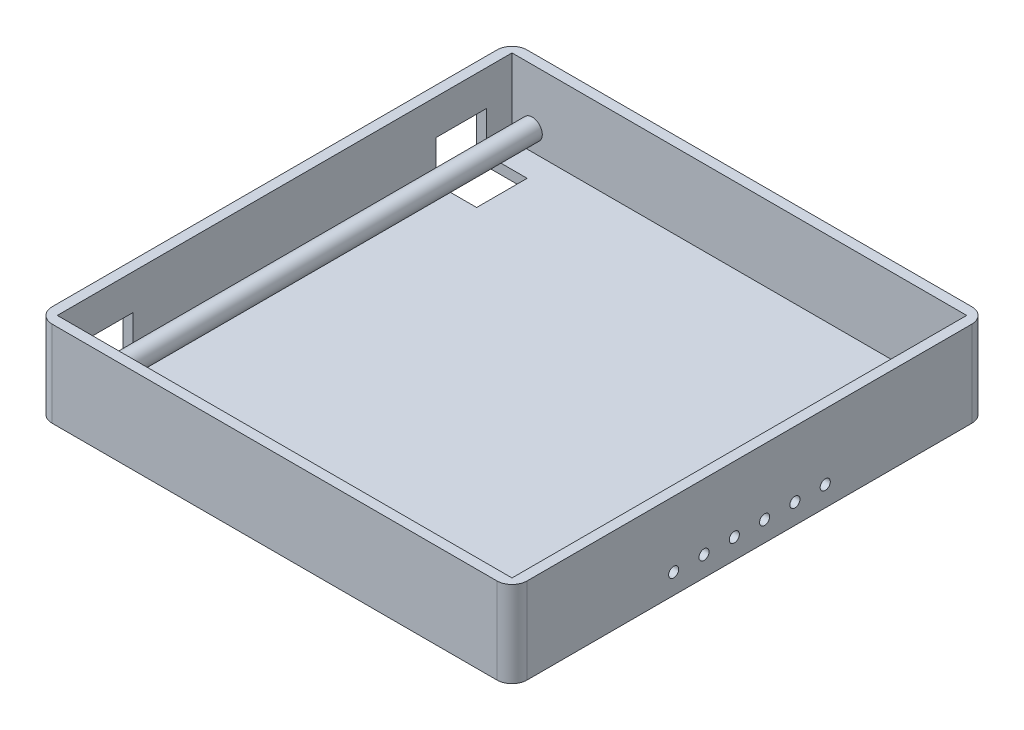
ISO-10303-21;
HEADER;
FILE_DESCRIPTION(('STEP AP214'),'2;1');
FILE_NAME('part.step','',(''),(''),'','','');
FILE_SCHEMA(('AUTOMOTIVE_DESIGN { 1 0 10303 214 1 1 1 1 }'));
ENDSEC;
DATA;
#1=APPLICATION_CONTEXT('core data for automotive mechanical design processes');
#2=APPLICATION_PROTOCOL_DEFINITION('international standard','automotive_design',2000,#1);
#3=PRODUCT_CONTEXT('',#1,'mechanical');
#4=PRODUCT('Part','Part','',(#3));
#5=PRODUCT_RELATED_PRODUCT_CATEGORY('part','',(#4));
#6=PRODUCT_DEFINITION_FORMATION('','',#4);
#7=PRODUCT_DEFINITION_CONTEXT('part definition',#1,'design');
#8=PRODUCT_DEFINITION('design','',#6,#7);
#9=PRODUCT_DEFINITION_SHAPE('','',#8);
#10=(LENGTH_UNIT() NAMED_UNIT(*) SI_UNIT(.MILLI.,.METRE.));
#11=(NAMED_UNIT(*) PLANE_ANGLE_UNIT() SI_UNIT($,.RADIAN.));
#12=(NAMED_UNIT(*) SI_UNIT($,.STERADIAN.) SOLID_ANGLE_UNIT());
#13=UNCERTAINTY_MEASURE_WITH_UNIT(LENGTH_MEASURE(1.E-05),#10,'distance_accuracy_value','');
#14=(GEOMETRIC_REPRESENTATION_CONTEXT(3) GLOBAL_UNCERTAINTY_ASSIGNED_CONTEXT((#13)) GLOBAL_UNIT_ASSIGNED_CONTEXT((#10,
#11,#12)) REPRESENTATION_CONTEXT('',''));
#15=CARTESIAN_POINT('',(0.,0.,0.));
#16=DIRECTION('',(0.,0.,1.));
#17=DIRECTION('',(1.,0.,0.));
#18=AXIS2_PLACEMENT_3D('',#15,#16,#17);
#19=CARTESIAN_POINT('',(46.,2.,-31.));
#20=DIRECTION('',(1.,0.,0.));
#21=DIRECTION('',(0.,0.,-1.));
#22=AXIS2_PLACEMENT_3D('',#19,#20,#21);
#23=CYLINDRICAL_SURFACE('',#22,0.499999999999999);
#24=CARTESIAN_POINT('',(46.,2.,-31.));
#25=DIRECTION('',(1.,0.,0.));
#26=DIRECTION('',(0.,0.,-1.));
#27=AXIS2_PLACEMENT_3D('',#24,#25,#26);
#28=CIRCLE('',#27,0.499999999999999);
#29=CARTESIAN_POINT('',(46.,2.,-31.5));
#30=VERTEX_POINT('',#29);
#31=EDGE_CURVE('E400',#30,#30,#28,.T.);
#32=ORIENTED_EDGE('',*,*,#31,.F.);
#33=EDGE_LOOP('',(#32));
#34=FACE_BOUND('',#33,.T.);
#35=CARTESIAN_POINT('',(47.,2.,-31.));
#36=DIRECTION('',(1.,0.,0.));
#37=DIRECTION('',(0.,0.,-1.));
#38=AXIS2_PLACEMENT_3D('',#35,#36,#37);
#39=CIRCLE('',#38,0.499999999999999);
#40=CARTESIAN_POINT('',(47.,2.,-31.5));
#41=VERTEX_POINT('',#40);
#42=EDGE_CURVE('E404',#41,#41,#39,.T.);
#43=ORIENTED_EDGE('',*,*,#42,.T.);
#44=EDGE_LOOP('',(#43));
#45=FACE_BOUND('',#44,.T.);
#46=ADVANCED_FACE('F39',(#34,#45),#23,.F.);
#47=CARTESIAN_POINT('',(46.,2.,-28.));
#48=DIRECTION('',(1.,0.,0.));
#49=DIRECTION('',(0.,0.,-1.));
#50=AXIS2_PLACEMENT_3D('',#47,#48,#49);
#51=CYLINDRICAL_SURFACE('',#50,0.499999999999999);
#52=CARTESIAN_POINT('',(46.,2.,-28.));
#53=DIRECTION('',(1.,0.,0.));
#54=DIRECTION('',(0.,0.,-1.));
#55=AXIS2_PLACEMENT_3D('',#52,#53,#54);
#56=CIRCLE('',#55,0.499999999999999);
#57=CARTESIAN_POINT('',(46.,2.,-28.5));
#58=VERTEX_POINT('',#57);
#59=EDGE_CURVE('E392',#58,#58,#56,.T.);
#60=ORIENTED_EDGE('',*,*,#59,.F.);
#61=EDGE_LOOP('',(#60));
#62=FACE_BOUND('',#61,.T.);
#63=CARTESIAN_POINT('',(47.,2.,-28.));
#64=DIRECTION('',(1.,0.,0.));
#65=DIRECTION('',(0.,0.,-1.));
#66=AXIS2_PLACEMENT_3D('',#63,#64,#65);
#67=CIRCLE('',#66,0.499999999999999);
#68=CARTESIAN_POINT('',(47.,2.,-28.5));
#69=VERTEX_POINT('',#68);
#70=EDGE_CURVE('E396',#69,#69,#67,.T.);
#71=ORIENTED_EDGE('',*,*,#70,.T.);
#72=EDGE_LOOP('',(#71));
#73=FACE_BOUND('',#72,.T.);
#74=ADVANCED_FACE('F581',(#62,#73),#51,.F.);
#75=CARTESIAN_POINT('',(46.,2.,-25.));
#76=DIRECTION('',(1.,0.,0.));
#77=DIRECTION('',(0.,0.,-1.));
#78=AXIS2_PLACEMENT_3D('',#75,#76,#77);
#79=CYLINDRICAL_SURFACE('',#78,0.499999999999999);
#80=CARTESIAN_POINT('',(46.,2.,-25.));
#81=DIRECTION('',(1.,0.,0.));
#82=DIRECTION('',(0.,0.,-1.));
#83=AXIS2_PLACEMENT_3D('',#80,#81,#82);
#84=CIRCLE('',#83,0.499999999999999);
#85=CARTESIAN_POINT('',(46.,2.,-25.5));
#86=VERTEX_POINT('',#85);
#87=EDGE_CURVE('E384',#86,#86,#84,.T.);
#88=ORIENTED_EDGE('',*,*,#87,.F.);
#89=EDGE_LOOP('',(#88));
#90=FACE_BOUND('',#89,.T.);
#91=CARTESIAN_POINT('',(47.,2.,-25.));
#92=DIRECTION('',(1.,0.,0.));
#93=DIRECTION('',(0.,0.,-1.));
#94=AXIS2_PLACEMENT_3D('',#91,#92,#93);
#95=CIRCLE('',#94,0.499999999999999);
#96=CARTESIAN_POINT('',(47.,2.,-25.5));
#97=VERTEX_POINT('',#96);
#98=EDGE_CURVE('E388',#97,#97,#95,.T.);
#99=ORIENTED_EDGE('',*,*,#98,.T.);
#100=EDGE_LOOP('',(#99));
#101=FACE_BOUND('',#100,.T.);
#102=ADVANCED_FACE('F587',(#90,#101),#79,.F.);
#103=CARTESIAN_POINT('',(46.,2.,-22.));
#104=DIRECTION('',(1.,0.,0.));
#105=DIRECTION('',(0.,0.,-1.));
#106=AXIS2_PLACEMENT_3D('',#103,#104,#105);
#107=CYLINDRICAL_SURFACE('',#106,0.499999999999999);
#108=CARTESIAN_POINT('',(46.,2.,-22.));
#109=DIRECTION('',(1.,0.,0.));
#110=DIRECTION('',(0.,0.,-1.));
#111=AXIS2_PLACEMENT_3D('',#108,#109,#110);
#112=CIRCLE('',#111,0.499999999999999);
#113=CARTESIAN_POINT('',(46.,2.,-22.5));
#114=VERTEX_POINT('',#113);
#115=EDGE_CURVE('E376',#114,#114,#112,.T.);
#116=ORIENTED_EDGE('',*,*,#115,.F.);
#117=EDGE_LOOP('',(#116));
#118=FACE_BOUND('',#117,.T.);
#119=CARTESIAN_POINT('',(47.,2.,-22.));
#120=DIRECTION('',(1.,0.,0.));
#121=DIRECTION('',(0.,0.,-1.));
#122=AXIS2_PLACEMENT_3D('',#119,#120,#121);
#123=CIRCLE('',#122,0.499999999999999);
#124=CARTESIAN_POINT('',(47.,2.,-22.5));
#125=VERTEX_POINT('',#124);
#126=EDGE_CURVE('E380',#125,#125,#123,.T.);
#127=ORIENTED_EDGE('',*,*,#126,.T.);
#128=EDGE_LOOP('',(#127));
#129=FACE_BOUND('',#128,.T.);
#130=ADVANCED_FACE('F641',(#118,#129),#107,.F.);
#131=CARTESIAN_POINT('',(0.,1.,0.));
#132=DIRECTION('',(1.,0.,0.));
#133=DIRECTION('',(0.,0.,-1.));
#134=AXIS2_PLACEMENT_3D('',#131,#132,#133);
#135=PLANE('',#134);
#136=DIRECTION('',(0.,0.,1.));
#137=VECTOR('',#136,1.);
#138=CARTESIAN_POINT('',(0.,0.,0.));
#139=LINE('',#138,#137);
#140=CARTESIAN_POINT('',(0.,0.,-45.5));
#141=VERTEX_POINT('',#140);
#142=CARTESIAN_POINT('',(0.,0.,-43.5));
#143=VERTEX_POINT('',#142);
#144=EDGE_CURVE('E360',#141,#143,#139,.T.);
#145=ORIENTED_EDGE('',*,*,#144,.T.);
#146=DIRECTION('',(0.,-1.,0.));
#147=VECTOR('',#146,1.);
#148=CARTESIAN_POINT('',(0.,0.,-43.5));
#149=LINE('',#148,#147);
#150=CARTESIAN_POINT('',(0.,5.,-43.5));
#151=VERTEX_POINT('',#150);
#152=EDGE_CURVE('E221',#151,#143,#149,.T.);
#153=ORIENTED_EDGE('',*,*,#152,.F.);
#154=DIRECTION('',(0.,0.,-1.));
#155=VECTOR('',#154,1.);
#156=CARTESIAN_POINT('',(0.,5.,-43.5));
#157=LINE('',#156,#155);
#158=CARTESIAN_POINT('',(0.,5.,-38.5));
#159=VERTEX_POINT('',#158);
#160=EDGE_CURVE('E522',#159,#151,#157,.T.);
#161=ORIENTED_EDGE('',*,*,#160,.F.);
#162=DIRECTION('',(0.,1.,0.));
#163=VECTOR('',#162,1.);
#164=CARTESIAN_POINT('',(0.,5.,-38.5));
#165=LINE('',#164,#163);
#166=CARTESIAN_POINT('',(0.,0.,-38.5));
#167=VERTEX_POINT('',#166);
#168=EDGE_CURVE('E261',#167,#159,#165,.T.);
#169=ORIENTED_EDGE('',*,*,#168,.F.);
#170=CARTESIAN_POINT('',(0.,0.,-8.5));
#171=VERTEX_POINT('',#170);
#172=EDGE_CURVE('E226',#167,#171,#139,.T.);
#173=ORIENTED_EDGE('',*,*,#172,.T.);
#174=DIRECTION('',(0.,-1.,0.));
#175=VECTOR('',#174,1.);
#176=CARTESIAN_POINT('',(0.,0.,-8.5));
#177=LINE('',#176,#175);
#178=CARTESIAN_POINT('',(0.,5.,-8.5));
#179=VERTEX_POINT('',#178);
#180=EDGE_CURVE('E242',#179,#171,#177,.T.);
#181=ORIENTED_EDGE('',*,*,#180,.F.);
#182=DIRECTION('',(0.,0.,-1.));
#183=VECTOR('',#182,1.);
#184=CARTESIAN_POINT('',(0.,5.,-8.5));
#185=LINE('',#184,#183);
#186=CARTESIAN_POINT('',(0.,5.,-3.5));
#187=VERTEX_POINT('',#186);
#188=EDGE_CURVE('E253',#187,#179,#185,.T.);
#189=ORIENTED_EDGE('',*,*,#188,.F.);
#190=DIRECTION('',(0.,1.,0.));
#191=VECTOR('',#190,1.);
#192=CARTESIAN_POINT('',(0.,5.,-3.5));
#193=LINE('',#192,#191);
#194=CARTESIAN_POINT('',(0.,0.,-3.5));
#195=VERTEX_POINT('',#194);
#196=EDGE_CURVE('E249',#195,#187,#193,.T.);
#197=ORIENTED_EDGE('',*,*,#196,.F.);
#198=CARTESIAN_POINT('',(0.,0.,-1.5));
#199=VERTEX_POINT('',#198);
#200=EDGE_CURVE('E359',#195,#199,#139,.T.);
#201=ORIENTED_EDGE('',*,*,#200,.T.);
#202=DIRECTION('',(0.,-1.,0.));
#203=VECTOR('',#202,1.);
#204=CARTESIAN_POINT('',(0.,1.,-1.5));
#205=LINE('',#204,#203);
#206=CARTESIAN_POINT('',(0.,8.5,-1.5));
#207=VERTEX_POINT('',#206);
#208=EDGE_CURVE('E451',#199,#207,#205,.F.);
#209=ORIENTED_EDGE('',*,*,#208,.T.);
#210=DIRECTION('',(0.,0.,1.));
#211=VECTOR('',#210,1.);
#212=CARTESIAN_POINT('',(0.,8.5,-47.));
#213=LINE('',#212,#211);
#214=CARTESIAN_POINT('',(0.,8.5,-45.5));
#215=VERTEX_POINT('',#214);
#216=EDGE_CURVE('E351',#215,#207,#213,.T.);
#217=ORIENTED_EDGE('',*,*,#216,.F.);
#218=DIRECTION('',(0.,-1.,0.));
#219=VECTOR('',#218,1.);
#220=CARTESIAN_POINT('',(0.,1.,-45.5));
#221=LINE('',#220,#219);
#222=EDGE_CURVE('E447',#215,#141,#221,.T.);
#223=ORIENTED_EDGE('',*,*,#222,.T.);
#224=EDGE_LOOP('',(#145,#153,#161,#169,#173,#181,#189,#197,#201,#209,#217,#223));
#225=FACE_BOUND('',#224,.T.);
#226=ADVANCED_FACE('F515',(#225),#135,.F.);
#227=CARTESIAN_POINT('',(0.,1.,0.));
#228=DIRECTION('',(0.,0.,-1.));
#229=DIRECTION('',(-1.,0.,0.));
#230=AXIS2_PLACEMENT_3D('',#227,#228,#229);
#231=PLANE('',#230);
#232=DIRECTION('',(1.,0.,0.));
#233=VECTOR('',#232,1.);
#234=CARTESIAN_POINT('',(0.,0.,0.));
#235=LINE('',#234,#233);
#236=CARTESIAN_POINT('',(1.5,0.,0.));
#237=VERTEX_POINT('',#236);
#238=CARTESIAN_POINT('',(45.5,0.,0.));
#239=VERTEX_POINT('',#238);
#240=EDGE_CURVE('E364',#237,#239,#235,.T.);
#241=ORIENTED_EDGE('',*,*,#240,.T.);
#242=DIRECTION('',(0.,-1.,0.));
#243=VECTOR('',#242,1.);
#244=CARTESIAN_POINT('',(45.5,1.,0.));
#245=LINE('',#244,#243);
#246=CARTESIAN_POINT('',(45.5,8.5,0.));
#247=VERTEX_POINT('',#246);
#248=EDGE_CURVE('E432',#239,#247,#245,.F.);
#249=ORIENTED_EDGE('',*,*,#248,.T.);
#250=DIRECTION('',(1.,0.,0.));
#251=VECTOR('',#250,1.);
#252=CARTESIAN_POINT('',(0.,8.5,0.));
#253=LINE('',#252,#251);
#254=CARTESIAN_POINT('',(1.5,8.5,0.));
#255=VERTEX_POINT('',#254);
#256=EDGE_CURVE('E355',#255,#247,#253,.T.);
#257=ORIENTED_EDGE('',*,*,#256,.F.);
#258=DIRECTION('',(0.,-1.,0.));
#259=VECTOR('',#258,1.);
#260=CARTESIAN_POINT('',(1.5,1.,0.));
#261=LINE('',#260,#259);
#262=EDGE_CURVE('E428',#255,#237,#261,.T.);
#263=ORIENTED_EDGE('',*,*,#262,.T.);
#264=EDGE_LOOP('',(#241,#249,#257,#263));
#265=FACE_BOUND('',#264,.T.);
#266=ADVANCED_FACE('F559',(#265),#231,.F.);
#267=CARTESIAN_POINT('',(47.,1.,0.));
#268=DIRECTION('',(-1.,0.,0.));
#269=DIRECTION('',(0.,0.,1.));
#270=AXIS2_PLACEMENT_3D('',#267,#268,#269);
#271=PLANE('',#270);
#272=CARTESIAN_POINT('',(47.,2.,-19.));
#273=DIRECTION('',(1.,0.,0.));
#274=DIRECTION('',(0.,0.,-1.));
#275=AXIS2_PLACEMENT_3D('',#272,#273,#274);
#276=CIRCLE('',#275,0.499999999999999);
#277=CARTESIAN_POINT('',(47.,2.,-19.5));
#278=VERTEX_POINT('',#277);
#279=EDGE_CURVE('E286',#278,#278,#276,.T.);
#280=ORIENTED_EDGE('',*,*,#279,.F.);
#281=EDGE_LOOP('',(#280));
#282=FACE_BOUND('',#281,.T.);
#283=CARTESIAN_POINT('',(47.,2.,-16.));
#284=DIRECTION('',(1.,0.,0.));
#285=DIRECTION('',(0.,0.,-1.));
#286=AXIS2_PLACEMENT_3D('',#283,#284,#285);
#287=CIRCLE('',#286,0.499999999999999);
#288=CARTESIAN_POINT('',(47.,2.,-16.5));
#289=VERTEX_POINT('',#288);
#290=EDGE_CURVE('E290',#289,#289,#287,.T.);
#291=ORIENTED_EDGE('',*,*,#290,.F.);
#292=EDGE_LOOP('',(#291));
#293=FACE_BOUND('',#292,.T.);
#294=DIRECTION('',(0.,0.,-1.));
#295=VECTOR('',#294,1.);
#296=CARTESIAN_POINT('',(47.,8.5,0.));
#297=LINE('',#296,#295);
#298=CARTESIAN_POINT('',(47.,8.5,-1.5));
#299=VERTEX_POINT('',#298);
#300=CARTESIAN_POINT('',(47.,8.5,-45.5));
#301=VERTEX_POINT('',#300);
#302=EDGE_CURVE('E343',#299,#301,#297,.T.);
#303=ORIENTED_EDGE('',*,*,#302,.F.);
#304=DIRECTION('',(0.,-1.,0.));
#305=VECTOR('',#304,1.);
#306=CARTESIAN_POINT('',(47.,1.,-1.5));
#307=LINE('',#306,#305);
#308=CARTESIAN_POINT('',(47.,0.,-1.5));
#309=VERTEX_POINT('',#308);
#310=EDGE_CURVE('E411',#299,#309,#307,.T.);
#311=ORIENTED_EDGE('',*,*,#310,.T.);
#312=DIRECTION('',(0.,0.,-1.));
#313=VECTOR('',#312,1.);
#314=CARTESIAN_POINT('',(47.,0.,0.));
#315=LINE('',#314,#313);
#316=CARTESIAN_POINT('',(47.,0.,-45.5));
#317=VERTEX_POINT('',#316);
#318=EDGE_CURVE('E368',#309,#317,#315,.T.);
#319=ORIENTED_EDGE('',*,*,#318,.T.);
#320=DIRECTION('',(0.,-1.,0.));
#321=VECTOR('',#320,1.);
#322=CARTESIAN_POINT('',(47.,1.,-45.5));
#323=LINE('',#322,#321);
#324=EDGE_CURVE('E408',#317,#301,#323,.F.);
#325=ORIENTED_EDGE('',*,*,#324,.T.);
#326=EDGE_LOOP('',(#303,#311,#319,#325));
#327=FACE_BOUND('',#326,.T.);
#328=ORIENTED_EDGE('',*,*,#126,.F.);
#329=EDGE_LOOP('',(#328));
#330=FACE_BOUND('',#329,.T.);
#331=ORIENTED_EDGE('',*,*,#98,.F.);
#332=EDGE_LOOP('',(#331));
#333=FACE_BOUND('',#332,.T.);
#334=ORIENTED_EDGE('',*,*,#70,.F.);
#335=EDGE_LOOP('',(#334));
#336=FACE_BOUND('',#335,.T.);
#337=ORIENTED_EDGE('',*,*,#42,.F.);
#338=EDGE_LOOP('',(#337));
#339=FACE_BOUND('',#338,.T.);
#340=ADVANCED_FACE('F568',(#282,#293,#327,#330,#333,#336,#339),#271,.F.);
#341=CARTESIAN_POINT('',(0.,1.,-47.));
#342=DIRECTION('',(0.,0.,1.));
#343=DIRECTION('',(1.,0.,0.));
#344=AXIS2_PLACEMENT_3D('',#341,#342,#343);
#345=PLANE('',#344);
#346=DIRECTION('',(-1.,0.,0.));
#347=VECTOR('',#346,1.);
#348=CARTESIAN_POINT('',(47.,8.5,-47.));
#349=LINE('',#348,#347);
#350=CARTESIAN_POINT('',(45.5,8.5,-47.));
#351=VERTEX_POINT('',#350);
#352=CARTESIAN_POINT('',(1.49999999999999,8.5,-47.));
#353=VERTEX_POINT('',#352);
#354=EDGE_CURVE('E347',#351,#353,#349,.T.);
#355=ORIENTED_EDGE('',*,*,#354,.F.);
#356=DIRECTION('',(0.,-1.,0.));
#357=VECTOR('',#356,1.);
#358=CARTESIAN_POINT('',(45.5,1.,-47.));
#359=LINE('',#358,#357);
#360=CARTESIAN_POINT('',(45.5,0.,-47.));
#361=VERTEX_POINT('',#360);
#362=EDGE_CURVE('E457',#351,#361,#359,.T.);
#363=ORIENTED_EDGE('',*,*,#362,.T.);
#364=DIRECTION('',(-1.,0.,0.));
#365=VECTOR('',#364,1.);
#366=CARTESIAN_POINT('',(0.,0.,-47.));
#367=LINE('',#366,#365);
#368=CARTESIAN_POINT('',(1.49999999999999,0.,-47.));
#369=VERTEX_POINT('',#368);
#370=EDGE_CURVE('E372',#361,#369,#367,.T.);
#371=ORIENTED_EDGE('',*,*,#370,.T.);
#372=DIRECTION('',(0.,-1.,0.));
#373=VECTOR('',#372,1.);
#374=CARTESIAN_POINT('',(1.49999999999999,1.,-47.));
#375=LINE('',#374,#373);
#376=EDGE_CURVE('E454',#369,#353,#375,.F.);
#377=ORIENTED_EDGE('',*,*,#376,.T.);
#378=EDGE_LOOP('',(#355,#363,#371,#377));
#379=FACE_BOUND('',#378,.T.);
#380=ADVANCED_FACE('F545',(#379),#345,.F.);
#381=CARTESIAN_POINT('',(0.,0.,0.));
#382=DIRECTION('',(0.,-1.,0.));
#383=DIRECTION('',(0.,0.,-1.));
#384=AXIS2_PLACEMENT_3D('',#381,#382,#383);
#385=PLANE('',#384);
#386=DIRECTION('',(-1.,0.,0.));
#387=VECTOR('',#386,1.);
#388=CARTESIAN_POINT('',(4.99999999999999,0.,-43.5));
#389=LINE('',#388,#387);
#390=CARTESIAN_POINT('',(4.99999999999999,0.,-43.5));
#391=VERTEX_POINT('',#390);
#392=EDGE_CURVE('E56',#391,#143,#389,.T.);
#393=ORIENTED_EDGE('',*,*,#392,.T.);
#394=ORIENTED_EDGE('',*,*,#144,.F.);
#395=CARTESIAN_POINT('',(1.49999999999999,0.,-45.5));
#396=DIRECTION('',(0.,-1.,0.));
#397=DIRECTION('',(0.,0.,-1.));
#398=AXIS2_PLACEMENT_3D('',#395,#396,#397);
#399=CIRCLE('',#398,1.5);
#400=EDGE_CURVE('E415',#141,#369,#399,.T.);
#401=ORIENTED_EDGE('',*,*,#400,.T.);
#402=ORIENTED_EDGE('',*,*,#370,.F.);
#403=CARTESIAN_POINT('',(45.5,0.,-45.5));
#404=DIRECTION('',(0.,-1.,0.));
#405=DIRECTION('',(0.,0.,-1.));
#406=AXIS2_PLACEMENT_3D('',#403,#404,#405);
#407=CIRCLE('',#406,1.5);
#408=EDGE_CURVE('E418',#361,#317,#407,.T.);
#409=ORIENTED_EDGE('',*,*,#408,.T.);
#410=ORIENTED_EDGE('',*,*,#318,.F.);
#411=CARTESIAN_POINT('',(45.5,0.,-1.5));
#412=DIRECTION('',(0.,-1.,0.));
#413=DIRECTION('',(0.,0.,-1.));
#414=AXIS2_PLACEMENT_3D('',#411,#412,#413);
#415=CIRCLE('',#414,1.5);
#416=EDGE_CURVE('E425',#309,#239,#415,.T.);
#417=ORIENTED_EDGE('',*,*,#416,.T.);
#418=ORIENTED_EDGE('',*,*,#240,.F.);
#419=CARTESIAN_POINT('',(1.5,0.,-1.5));
#420=DIRECTION('',(0.,-1.,0.));
#421=DIRECTION('',(0.,0.,-1.));
#422=AXIS2_PLACEMENT_3D('',#419,#420,#421);
#423=CIRCLE('',#422,1.5);
#424=EDGE_CURVE('E421',#237,#199,#423,.T.);
#425=ORIENTED_EDGE('',*,*,#424,.T.);
#426=ORIENTED_EDGE('',*,*,#200,.F.);
#427=DIRECTION('',(-1.,0.,0.));
#428=VECTOR('',#427,1.);
#429=CARTESIAN_POINT('',(5.,0.,-3.5));
#430=LINE('',#429,#428);
#431=CARTESIAN_POINT('',(5.,0.,-3.5));
#432=VERTEX_POINT('',#431);
#433=EDGE_CURVE('E248',#432,#195,#430,.T.);
#434=ORIENTED_EDGE('',*,*,#433,.F.);
#435=DIRECTION('',(0.,0.,1.));
#436=VECTOR('',#435,1.);
#437=CARTESIAN_POINT('',(5.,0.,-3.5));
#438=LINE('',#437,#436);
#439=CARTESIAN_POINT('',(5.,0.,-8.5));
#440=VERTEX_POINT('',#439);
#441=EDGE_CURVE('E237',#440,#432,#438,.T.);
#442=ORIENTED_EDGE('',*,*,#441,.F.);
#443=DIRECTION('',(-1.,0.,0.));
#444=VECTOR('',#443,1.);
#445=CARTESIAN_POINT('',(5.,0.,-8.5));
#446=LINE('',#445,#444);
#447=EDGE_CURVE('E64',#440,#171,#446,.T.);
#448=ORIENTED_EDGE('',*,*,#447,.T.);
#449=ORIENTED_EDGE('',*,*,#172,.F.);
#450=DIRECTION('',(-1.,0.,0.));
#451=VECTOR('',#450,1.);
#452=CARTESIAN_POINT('',(4.99999999999999,0.,-38.5));
#453=LINE('',#452,#451);
#454=CARTESIAN_POINT('',(4.99999999999999,0.,-38.5));
#455=VERTEX_POINT('',#454);
#456=EDGE_CURVE('E207',#455,#167,#453,.T.);
#457=ORIENTED_EDGE('',*,*,#456,.F.);
#458=DIRECTION('',(0.,0.,1.));
#459=VECTOR('',#458,1.);
#460=CARTESIAN_POINT('',(4.99999999999999,0.,-38.5));
#461=LINE('',#460,#459);
#462=EDGE_CURVE('E215',#391,#455,#461,.T.);
#463=ORIENTED_EDGE('',*,*,#462,.F.);
#464=EDGE_LOOP('',(#393,#394,#401,#402,#409,#410,#417,#418,#425,#426,#434,#442,#448,#449,#457,#463));
#465=FACE_BOUND('',#464,.T.);
#466=ADVANCED_FACE('F224',(#465),#385,.T.);
#467=CARTESIAN_POINT('',(0.,8.5,0.));
#468=DIRECTION('',(0.,1.,0.));
#469=DIRECTION('',(0.,0.,1.));
#470=AXIS2_PLACEMENT_3D('',#467,#468,#469);
#471=PLANE('',#470);
#472=ORIENTED_EDGE('',*,*,#256,.T.);
#473=CARTESIAN_POINT('',(45.5,8.5,-1.5));
#474=DIRECTION('',(0.,1.,0.));
#475=DIRECTION('',(0.,0.,1.));
#476=AXIS2_PLACEMENT_3D('',#473,#474,#475);
#477=CIRCLE('',#476,1.5);
#478=EDGE_CURVE('E444',#247,#299,#477,.T.);
#479=ORIENTED_EDGE('',*,*,#478,.T.);
#480=ORIENTED_EDGE('',*,*,#302,.T.);
#481=CARTESIAN_POINT('',(45.5,8.5,-45.5));
#482=DIRECTION('',(0.,1.,0.));
#483=DIRECTION('',(0.,0.,1.));
#484=AXIS2_PLACEMENT_3D('',#481,#482,#483);
#485=CIRCLE('',#484,1.5);
#486=EDGE_CURVE('E438',#301,#351,#485,.T.);
#487=ORIENTED_EDGE('',*,*,#486,.T.);
#488=ORIENTED_EDGE('',*,*,#354,.T.);
#489=CARTESIAN_POINT('',(1.49999999999999,8.5,-45.5));
#490=DIRECTION('',(0.,1.,0.));
#491=DIRECTION('',(0.,0.,1.));
#492=AXIS2_PLACEMENT_3D('',#489,#490,#491);
#493=CIRCLE('',#492,1.5);
#494=EDGE_CURVE('E435',#353,#215,#493,.T.);
#495=ORIENTED_EDGE('',*,*,#494,.T.);
#496=ORIENTED_EDGE('',*,*,#216,.T.);
#497=CARTESIAN_POINT('',(1.5,8.5,-1.5));
#498=DIRECTION('',(0.,1.,0.));
#499=DIRECTION('',(0.,0.,1.));
#500=AXIS2_PLACEMENT_3D('',#497,#498,#499);
#501=CIRCLE('',#500,1.5);
#502=EDGE_CURVE('E441',#207,#255,#501,.T.);
#503=ORIENTED_EDGE('',*,*,#502,.T.);
#504=EDGE_LOOP('',(#472,#479,#480,#487,#488,#495,#496,#503));
#505=FACE_BOUND('',#504,.T.);
#506=DIRECTION('',(-1.,0.,0.));
#507=VECTOR('',#506,1.);
#508=CARTESIAN_POINT('',(46.,8.5,-46.));
#509=LINE('',#508,#507);
#510=CARTESIAN_POINT('',(46.,8.5,-46.));
#511=VERTEX_POINT('',#510);
#512=CARTESIAN_POINT('',(0.999999999999986,8.5,-46.));
#513=VERTEX_POINT('',#512);
#514=EDGE_CURVE('E302',#511,#513,#509,.T.);
#515=ORIENTED_EDGE('',*,*,#514,.F.);
#516=DIRECTION('',(0.,0.,-1.));
#517=VECTOR('',#516,1.);
#518=CARTESIAN_POINT('',(46.,8.5,-1.));
#519=LINE('',#518,#517);
#520=CARTESIAN_POINT('',(46.,8.5,-1.));
#521=VERTEX_POINT('',#520);
#522=EDGE_CURVE('E299',#521,#511,#519,.T.);
#523=ORIENTED_EDGE('',*,*,#522,.F.);
#524=DIRECTION('',(1.,0.,0.));
#525=VECTOR('',#524,1.);
#526=CARTESIAN_POINT('',(1.,8.5,-1.));
#527=LINE('',#526,#525);
#528=CARTESIAN_POINT('',(1.,8.5,-1.));
#529=VERTEX_POINT('',#528);
#530=EDGE_CURVE('E310',#529,#521,#527,.T.);
#531=ORIENTED_EDGE('',*,*,#530,.F.);
#532=DIRECTION('',(0.,0.,1.));
#533=VECTOR('',#532,1.);
#534=CARTESIAN_POINT('',(0.999999999999986,8.5,-46.));
#535=LINE('',#534,#533);
#536=EDGE_CURVE('E306',#513,#529,#535,.T.);
#537=ORIENTED_EDGE('',*,*,#536,.F.);
#538=EDGE_LOOP('',(#515,#523,#531,#537));
#539=FACE_BOUND('',#538,.T.);
#540=ADVANCED_FACE('F549',(#505,#539),#471,.T.);
#541=CARTESIAN_POINT('',(46.,8.5,-1.));
#542=DIRECTION('',(-1.,0.,0.));
#543=DIRECTION('',(0.,0.,1.));
#544=AXIS2_PLACEMENT_3D('',#541,#542,#543);
#545=PLANE('',#544);
#546=CARTESIAN_POINT('',(46.,2.,-19.));
#547=DIRECTION('',(1.,0.,0.));
#548=DIRECTION('',(0.,0.,-1.));
#549=AXIS2_PLACEMENT_3D('',#546,#547,#548);
#550=CIRCLE('',#549,0.499999999999999);
#551=CARTESIAN_POINT('',(46.,2.,-19.5));
#552=VERTEX_POINT('',#551);
#553=EDGE_CURVE('E282',#552,#552,#550,.T.);
#554=ORIENTED_EDGE('',*,*,#553,.T.);
#555=EDGE_LOOP('',(#554));
#556=FACE_BOUND('',#555,.T.);
#557=CARTESIAN_POINT('',(46.,2.,-16.));
#558=DIRECTION('',(1.,0.,0.));
#559=DIRECTION('',(0.,0.,-1.));
#560=AXIS2_PLACEMENT_3D('',#557,#558,#559);
#561=CIRCLE('',#560,0.499999999999999);
#562=CARTESIAN_POINT('',(46.,2.,-16.5));
#563=VERTEX_POINT('',#562);
#564=EDGE_CURVE('E291',#563,#563,#561,.T.);
#565=ORIENTED_EDGE('',*,*,#564,.T.);
#566=EDGE_LOOP('',(#565));
#567=FACE_BOUND('',#566,.T.);
#568=DIRECTION('',(0.,0.,-1.));
#569=VECTOR('',#568,1.);
#570=CARTESIAN_POINT('',(46.,1.,-1.));
#571=LINE('',#570,#569);
#572=CARTESIAN_POINT('',(46.,1.,-1.));
#573=VERTEX_POINT('',#572);
#574=CARTESIAN_POINT('',(46.,1.,-46.));
#575=VERTEX_POINT('',#574);
#576=EDGE_CURVE('E295',#573,#575,#571,.T.);
#577=ORIENTED_EDGE('',*,*,#576,.F.);
#578=DIRECTION('',(0.,-1.,0.));
#579=VECTOR('',#578,1.);
#580=CARTESIAN_POINT('',(46.,8.5,-1.));
#581=LINE('',#580,#579);
#582=EDGE_CURVE('E313',#521,#573,#581,.T.);
#583=ORIENTED_EDGE('',*,*,#582,.F.);
#584=ORIENTED_EDGE('',*,*,#522,.T.);
#585=DIRECTION('',(0.,-1.,0.));
#586=VECTOR('',#585,1.);
#587=CARTESIAN_POINT('',(46.,8.5,-46.));
#588=LINE('',#587,#586);
#589=EDGE_CURVE('E339',#511,#575,#588,.T.);
#590=ORIENTED_EDGE('',*,*,#589,.T.);
#591=EDGE_LOOP('',(#577,#583,#584,#590));
#592=FACE_BOUND('',#591,.T.);
#593=ORIENTED_EDGE('',*,*,#115,.T.);
#594=EDGE_LOOP('',(#593));
#595=FACE_BOUND('',#594,.T.);
#596=ORIENTED_EDGE('',*,*,#87,.T.);
#597=EDGE_LOOP('',(#596));
#598=FACE_BOUND('',#597,.T.);
#599=ORIENTED_EDGE('',*,*,#59,.T.);
#600=EDGE_LOOP('',(#599));
#601=FACE_BOUND('',#600,.T.);
#602=ORIENTED_EDGE('',*,*,#31,.T.);
#603=EDGE_LOOP('',(#602));
#604=FACE_BOUND('',#603,.T.);
#605=ADVANCED_FACE('F621',(#556,#567,#592,#595,#598,#601,#604),#545,.T.);
#606=CARTESIAN_POINT('',(46.,8.5,-46.));
#607=DIRECTION('',(0.,0.,1.));
#608=DIRECTION('',(1.,0.,0.));
#609=AXIS2_PLACEMENT_3D('',#606,#607,#608);
#610=PLANE('',#609);
#611=CARTESIAN_POINT('',(2.99999999999999,3.,-46.));
#612=DIRECTION('',(0.,0.,1.));
#613=DIRECTION('',(1.,0.,0.));
#614=AXIS2_PLACEMENT_3D('',#611,#612,#613);
#615=CIRCLE('',#614,0.999999999999999);
#616=CARTESIAN_POINT('',(3.99999999999999,3.,-46.));
#617=VERTEX_POINT('',#616);
#618=EDGE_CURVE('E831',#617,#617,#615,.T.);
#619=ORIENTED_EDGE('',*,*,#618,.F.);
#620=EDGE_LOOP('',(#619));
#621=FACE_BOUND('',#620,.T.);
#622=DIRECTION('',(-1.,0.,0.));
#623=VECTOR('',#622,1.);
#624=CARTESIAN_POINT('',(46.,1.,-46.));
#625=LINE('',#624,#623);
#626=CARTESIAN_POINT('',(0.999999999999986,1.,-46.));
#627=VERTEX_POINT('',#626);
#628=EDGE_CURVE('E317',#575,#627,#625,.T.);
#629=ORIENTED_EDGE('',*,*,#628,.F.);
#630=ORIENTED_EDGE('',*,*,#589,.F.);
#631=ORIENTED_EDGE('',*,*,#514,.T.);
#632=DIRECTION('',(0.,-1.,0.));
#633=VECTOR('',#632,1.);
#634=CARTESIAN_POINT('',(0.999999999999986,8.5,-46.));
#635=LINE('',#634,#633);
#636=EDGE_CURVE('E336',#513,#627,#635,.T.);
#637=ORIENTED_EDGE('',*,*,#636,.T.);
#638=EDGE_LOOP('',(#629,#630,#631,#637));
#639=FACE_BOUND('',#638,.T.);
#640=ADVANCED_FACE('F618',(#621,#639),#610,.T.);
#641=CARTESIAN_POINT('',(0.999999999999986,8.5,-46.));
#642=DIRECTION('',(1.,0.,0.));
#643=DIRECTION('',(0.,0.,-1.));
#644=AXIS2_PLACEMENT_3D('',#641,#642,#643);
#645=PLANE('',#644);
#646=DIRECTION('',(0.,1.,0.));
#647=VECTOR('',#646,1.);
#648=CARTESIAN_POINT('',(0.999999999999987,8.5,-43.5));
#649=LINE('',#648,#647);
#650=CARTESIAN_POINT('',(0.999999999999986,1.,-43.5));
#651=VERTEX_POINT('',#650);
#652=CARTESIAN_POINT('',(0.999999999999988,5.,-43.5));
#653=VERTEX_POINT('',#652);
#654=EDGE_CURVE('E279',#651,#653,#649,.T.);
#655=ORIENTED_EDGE('',*,*,#654,.F.);
#656=DIRECTION('',(0.,0.,1.));
#657=VECTOR('',#656,1.);
#658=CARTESIAN_POINT('',(0.999999999999986,1.,-46.));
#659=LINE('',#658,#657);
#660=EDGE_CURVE('E322',#627,#651,#659,.T.);
#661=ORIENTED_EDGE('',*,*,#660,.F.);
#662=ORIENTED_EDGE('',*,*,#636,.F.);
#663=ORIENTED_EDGE('',*,*,#536,.T.);
#664=DIRECTION('',(0.,-1.,0.));
#665=VECTOR('',#664,1.);
#666=CARTESIAN_POINT('',(1.,8.5,-1.));
#667=LINE('',#666,#665);
#668=CARTESIAN_POINT('',(1.,1.,-1.));
#669=VERTEX_POINT('',#668);
#670=EDGE_CURVE('E332',#529,#669,#667,.T.);
#671=ORIENTED_EDGE('',*,*,#670,.T.);
#672=CARTESIAN_POINT('',(0.999999999999986,1.,-3.5));
#673=VERTEX_POINT('',#672);
#674=EDGE_CURVE('E321',#673,#669,#659,.T.);
#675=ORIENTED_EDGE('',*,*,#674,.F.);
#676=DIRECTION('',(0.,-1.,0.));
#677=VECTOR('',#676,1.);
#678=CARTESIAN_POINT('',(1.,8.49999999999997,-3.5));
#679=LINE('',#678,#677);
#680=CARTESIAN_POINT('',(1.,5.,-3.5));
#681=VERTEX_POINT('',#680);
#682=EDGE_CURVE('E270',#681,#673,#679,.T.);
#683=ORIENTED_EDGE('',*,*,#682,.F.);
#684=DIRECTION('',(0.,0.,1.));
#685=VECTOR('',#684,1.);
#686=CARTESIAN_POINT('',(0.999999999999986,5.,-46.));
#687=LINE('',#686,#685);
#688=CARTESIAN_POINT('',(0.999999999999999,5.,-8.5));
#689=VERTEX_POINT('',#688);
#690=EDGE_CURVE('E49',#689,#681,#687,.T.);
#691=ORIENTED_EDGE('',*,*,#690,.F.);
#692=DIRECTION('',(0.,1.,0.));
#693=VECTOR('',#692,1.);
#694=CARTESIAN_POINT('',(0.999999999999999,8.5,-8.5));
#695=LINE('',#694,#693);
#696=CARTESIAN_POINT('',(0.999999999999986,1.,-8.5));
#697=VERTEX_POINT('',#696);
#698=EDGE_CURVE('E273',#697,#689,#695,.T.);
#699=ORIENTED_EDGE('',*,*,#698,.F.);
#700=CARTESIAN_POINT('',(0.999999999999986,1.,-38.5));
#701=VERTEX_POINT('',#700);
#702=EDGE_CURVE('E326',#701,#697,#659,.T.);
#703=ORIENTED_EDGE('',*,*,#702,.F.);
#704=DIRECTION('',(0.,-1.,0.));
#705=VECTOR('',#704,1.);
#706=CARTESIAN_POINT('',(0.999999999999989,8.5,-38.5));
#707=LINE('',#706,#705);
#708=CARTESIAN_POINT('',(0.999999999999989,5.,-38.5));
#709=VERTEX_POINT('',#708);
#710=EDGE_CURVE('E276',#709,#701,#707,.T.);
#711=ORIENTED_EDGE('',*,*,#710,.F.);
#712=DIRECTION('',(0.,0.,1.));
#713=VECTOR('',#712,1.);
#714=CARTESIAN_POINT('',(0.999999999999986,5.,-46.));
#715=LINE('',#714,#713);
#716=EDGE_CURVE('E11',#653,#709,#715,.T.);
#717=ORIENTED_EDGE('',*,*,#716,.F.);
#718=EDGE_LOOP('',(#655,#661,#662,#663,#671,#675,#683,#691,#699,#703,#711,#717));
#719=FACE_BOUND('',#718,.T.);
#720=ADVANCED_FACE('F498',(#719),#645,.T.);
#721=CARTESIAN_POINT('',(1.,8.5,-1.));
#722=DIRECTION('',(0.,0.,-1.));
#723=DIRECTION('',(-1.,0.,0.));
#724=AXIS2_PLACEMENT_3D('',#721,#722,#723);
#725=PLANE('',#724);
#726=CARTESIAN_POINT('',(2.99999999999999,3.,-1.));
#727=DIRECTION('',(0.,0.,-1.));
#728=DIRECTION('',(-1.,0.,0.));
#729=AXIS2_PLACEMENT_3D('',#726,#727,#728);
#730=CIRCLE('',#729,0.999999999999999);
#731=CARTESIAN_POINT('',(1.99999999999999,3.,-1.));
#732=VERTEX_POINT('',#731);
#733=EDGE_CURVE('E43',#732,#732,#730,.F.);
#734=ORIENTED_EDGE('',*,*,#733,.T.);
#735=EDGE_LOOP('',(#734));
#736=FACE_BOUND('',#735,.T.);
#737=DIRECTION('',(1.,0.,0.));
#738=VECTOR('',#737,1.);
#739=CARTESIAN_POINT('',(1.,1.,-1.));
#740=LINE('',#739,#738);
#741=EDGE_CURVE('E303',#669,#573,#740,.T.);
#742=ORIENTED_EDGE('',*,*,#741,.F.);
#743=ORIENTED_EDGE('',*,*,#670,.F.);
#744=ORIENTED_EDGE('',*,*,#530,.T.);
#745=ORIENTED_EDGE('',*,*,#582,.T.);
#746=EDGE_LOOP('',(#742,#743,#744,#745));
#747=FACE_BOUND('',#746,.T.);
#748=ADVANCED_FACE('F612',(#736,#747),#725,.T.);
#749=CARTESIAN_POINT('',(0.,1.,0.));
#750=DIRECTION('',(0.,-1.,0.));
#751=DIRECTION('',(0.,0.,-1.));
#752=AXIS2_PLACEMENT_3D('',#749,#750,#751);
#753=PLANE('',#752);
#754=ORIENTED_EDGE('',*,*,#660,.T.);
#755=DIRECTION('',(1.,0.,0.));
#756=VECTOR('',#755,1.);
#757=CARTESIAN_POINT('',(0.,1.,-43.5));
#758=LINE('',#757,#756);
#759=CARTESIAN_POINT('',(4.99999999999999,1.,-43.5));
#760=VERTEX_POINT('',#759);
#761=EDGE_CURVE('E478',#651,#760,#758,.T.);
#762=ORIENTED_EDGE('',*,*,#761,.T.);
#763=DIRECTION('',(0.,0.,1.));
#764=VECTOR('',#763,1.);
#765=CARTESIAN_POINT('',(5.,1.,0.));
#766=LINE('',#765,#764);
#767=CARTESIAN_POINT('',(4.99999999999999,1.,-38.5));
#768=VERTEX_POINT('',#767);
#769=EDGE_CURVE('E473',#760,#768,#766,.T.);
#770=ORIENTED_EDGE('',*,*,#769,.T.);
#771=DIRECTION('',(-1.,0.,0.));
#772=VECTOR('',#771,1.);
#773=CARTESIAN_POINT('',(0.,1.,-38.5));
#774=LINE('',#773,#772);
#775=EDGE_CURVE('E210',#768,#701,#774,.T.);
#776=ORIENTED_EDGE('',*,*,#775,.T.);
#777=ORIENTED_EDGE('',*,*,#702,.T.);
#778=DIRECTION('',(1.,0.,0.));
#779=VECTOR('',#778,1.);
#780=CARTESIAN_POINT('',(0.,1.,-8.5));
#781=LINE('',#780,#779);
#782=CARTESIAN_POINT('',(5.,1.,-8.5));
#783=VERTEX_POINT('',#782);
#784=EDGE_CURVE('E469',#697,#783,#781,.T.);
#785=ORIENTED_EDGE('',*,*,#784,.T.);
#786=DIRECTION('',(0.,0.,1.));
#787=VECTOR('',#786,1.);
#788=CARTESIAN_POINT('',(5.,1.,0.));
#789=LINE('',#788,#787);
#790=CARTESIAN_POINT('',(5.,1.,-3.5));
#791=VERTEX_POINT('',#790);
#792=EDGE_CURVE('E461',#783,#791,#789,.T.);
#793=ORIENTED_EDGE('',*,*,#792,.T.);
#794=DIRECTION('',(-1.,0.,0.));
#795=VECTOR('',#794,1.);
#796=CARTESIAN_POINT('',(0.,1.,-3.5));
#797=LINE('',#796,#795);
#798=EDGE_CURVE('E465',#791,#673,#797,.T.);
#799=ORIENTED_EDGE('',*,*,#798,.T.);
#800=ORIENTED_EDGE('',*,*,#674,.T.);
#801=ORIENTED_EDGE('',*,*,#741,.T.);
#802=ORIENTED_EDGE('',*,*,#576,.T.);
#803=ORIENTED_EDGE('',*,*,#628,.T.);
#804=EDGE_LOOP('',(#754,#762,#770,#776,#777,#785,#793,#799,#800,#801,#802,#803));
#805=FACE_BOUND('',#804,.T.);
#806=ADVANCED_FACE('F505',(#805),#753,.F.);
#807=CARTESIAN_POINT('',(46.,2.,-16.));
#808=DIRECTION('',(1.,0.,0.));
#809=DIRECTION('',(0.,0.,-1.));
#810=AXIS2_PLACEMENT_3D('',#807,#808,#809);
#811=CYLINDRICAL_SURFACE('',#810,0.499999999999999);
#812=ORIENTED_EDGE('',*,*,#564,.F.);
#813=EDGE_LOOP('',(#812));
#814=FACE_BOUND('',#813,.T.);
#815=ORIENTED_EDGE('',*,*,#290,.T.);
#816=EDGE_LOOP('',(#815));
#817=FACE_BOUND('',#816,.T.);
#818=ADVANCED_FACE('F599',(#814,#817),#811,.F.);
#819=CARTESIAN_POINT('',(46.,2.,-19.));
#820=DIRECTION('',(1.,0.,0.));
#821=DIRECTION('',(0.,0.,-1.));
#822=AXIS2_PLACEMENT_3D('',#819,#820,#821);
#823=CYLINDRICAL_SURFACE('',#822,0.499999999999999);
#824=ORIENTED_EDGE('',*,*,#553,.F.);
#825=EDGE_LOOP('',(#824));
#826=FACE_BOUND('',#825,.T.);
#827=ORIENTED_EDGE('',*,*,#279,.T.);
#828=EDGE_LOOP('',(#827));
#829=FACE_BOUND('',#828,.T.);
#830=ADVANCED_FACE('F595',(#826,#829),#823,.F.);
#831=CARTESIAN_POINT('',(45.5,1.,-1.5));
#832=DIRECTION('',(0.,-1.,0.));
#833=DIRECTION('',(0.,0.,-1.));
#834=AXIS2_PLACEMENT_3D('',#831,#832,#833);
#835=CYLINDRICAL_SURFACE('',#834,1.5);
#836=ORIENTED_EDGE('',*,*,#478,.F.);
#837=ORIENTED_EDGE('',*,*,#248,.F.);
#838=ORIENTED_EDGE('',*,*,#416,.F.);
#839=ORIENTED_EDGE('',*,*,#310,.F.);
#840=EDGE_LOOP('',(#836,#837,#838,#839));
#841=FACE_BOUND('',#840,.T.);
#842=ADVANCED_FACE('F563',(#841),#835,.T.);
#843=CARTESIAN_POINT('',(1.5,1.,-1.5));
#844=DIRECTION('',(0.,-1.,0.));
#845=DIRECTION('',(0.,0.,-1.));
#846=AXIS2_PLACEMENT_3D('',#843,#844,#845);
#847=CYLINDRICAL_SURFACE('',#846,1.5);
#848=ORIENTED_EDGE('',*,*,#502,.F.);
#849=ORIENTED_EDGE('',*,*,#208,.F.);
#850=ORIENTED_EDGE('',*,*,#424,.F.);
#851=ORIENTED_EDGE('',*,*,#262,.F.);
#852=EDGE_LOOP('',(#848,#849,#850,#851));
#853=FACE_BOUND('',#852,.T.);
#854=ADVANCED_FACE('F554',(#853),#847,.T.);
#855=CARTESIAN_POINT('',(45.5,1.,-45.5));
#856=DIRECTION('',(0.,-1.,0.));
#857=DIRECTION('',(0.,0.,-1.));
#858=AXIS2_PLACEMENT_3D('',#855,#856,#857);
#859=CYLINDRICAL_SURFACE('',#858,1.5);
#860=ORIENTED_EDGE('',*,*,#486,.F.);
#861=ORIENTED_EDGE('',*,*,#324,.F.);
#862=ORIENTED_EDGE('',*,*,#408,.F.);
#863=ORIENTED_EDGE('',*,*,#362,.F.);
#864=EDGE_LOOP('',(#860,#861,#862,#863));
#865=FACE_BOUND('',#864,.T.);
#866=ADVANCED_FACE('F573',(#865),#859,.T.);
#867=CARTESIAN_POINT('',(1.49999999999999,1.,-45.5));
#868=DIRECTION('',(0.,-1.,0.));
#869=DIRECTION('',(0.,0.,-1.));
#870=AXIS2_PLACEMENT_3D('',#867,#868,#869);
#871=CYLINDRICAL_SURFACE('',#870,1.5);
#872=ORIENTED_EDGE('',*,*,#494,.F.);
#873=ORIENTED_EDGE('',*,*,#376,.F.);
#874=ORIENTED_EDGE('',*,*,#400,.F.);
#875=ORIENTED_EDGE('',*,*,#222,.F.);
#876=EDGE_LOOP('',(#872,#873,#874,#875));
#877=FACE_BOUND('',#876,.T.);
#878=ADVANCED_FACE('F41',(#877),#871,.T.);
#879=CARTESIAN_POINT('',(5.,0.,0.));
#880=DIRECTION('',(1.,0.,0.));
#881=DIRECTION('',(0.,0.,-1.));
#882=AXIS2_PLACEMENT_3D('',#879,#880,#881);
#883=PLANE('',#882);
#884=DIRECTION('',(0.,-1.,0.));
#885=VECTOR('',#884,1.);
#886=CARTESIAN_POINT('',(5.,0.,-8.5));
#887=LINE('',#886,#885);
#888=EDGE_CURVE('E245',#783,#440,#887,.T.);
#889=ORIENTED_EDGE('',*,*,#888,.T.);
#890=ORIENTED_EDGE('',*,*,#441,.T.);
#891=DIRECTION('',(0.,1.,0.));
#892=VECTOR('',#891,1.);
#893=CARTESIAN_POINT('',(5.,5.,-3.5));
#894=LINE('',#893,#892);
#895=EDGE_CURVE('E241',#432,#791,#894,.T.);
#896=ORIENTED_EDGE('',*,*,#895,.T.);
#897=ORIENTED_EDGE('',*,*,#792,.F.);
#898=EDGE_LOOP('',(#889,#890,#896,#897));
#899=FACE_BOUND('',#898,.T.);
#900=ADVANCED_FACE('F511',(#899),#883,.F.);
#901=CARTESIAN_POINT('',(5.,0.,-8.5));
#902=DIRECTION('',(0.,0.,-1.));
#903=DIRECTION('',(-1.,0.,0.));
#904=AXIS2_PLACEMENT_3D('',#901,#902,#903);
#905=PLANE('',#904);
#906=ORIENTED_EDGE('',*,*,#698,.T.);
#907=DIRECTION('',(-1.,0.,0.));
#908=VECTOR('',#907,1.);
#909=CARTESIAN_POINT('',(5.,5.,-8.5));
#910=LINE('',#909,#908);
#911=EDGE_CURVE('E262',#689,#179,#910,.T.);
#912=ORIENTED_EDGE('',*,*,#911,.T.);
#913=ORIENTED_EDGE('',*,*,#180,.T.);
#914=ORIENTED_EDGE('',*,*,#447,.F.);
#915=ORIENTED_EDGE('',*,*,#888,.F.);
#916=ORIENTED_EDGE('',*,*,#784,.F.);
#917=EDGE_LOOP('',(#906,#912,#913,#914,#915,#916));
#918=FACE_BOUND('',#917,.T.);
#919=ADVANCED_FACE('F508',(#918),#905,.F.);
#920=CARTESIAN_POINT('',(5.,5.,-8.5));
#921=DIRECTION('',(0.,1.,0.));
#922=DIRECTION('',(0.,0.,1.));
#923=AXIS2_PLACEMENT_3D('',#920,#921,#922);
#924=PLANE('',#923);
#925=ORIENTED_EDGE('',*,*,#690,.T.);
#926=DIRECTION('',(-1.,0.,0.));
#927=VECTOR('',#926,1.);
#928=CARTESIAN_POINT('',(5.,5.,-3.5));
#929=LINE('',#928,#927);
#930=EDGE_CURVE('E265',#681,#187,#929,.T.);
#931=ORIENTED_EDGE('',*,*,#930,.T.);
#932=ORIENTED_EDGE('',*,*,#188,.T.);
#933=ORIENTED_EDGE('',*,*,#911,.F.);
#934=EDGE_LOOP('',(#925,#931,#932,#933));
#935=FACE_BOUND('',#934,.T.);
#936=ADVANCED_FACE('F487',(#935),#924,.F.);
#937=CARTESIAN_POINT('',(5.,5.,-3.5));
#938=DIRECTION('',(0.,0.,1.));
#939=DIRECTION('',(0.,-1.,0.));
#940=AXIS2_PLACEMENT_3D('',#937,#938,#939);
#941=PLANE('',#940);
#942=ORIENTED_EDGE('',*,*,#682,.T.);
#943=ORIENTED_EDGE('',*,*,#798,.F.);
#944=ORIENTED_EDGE('',*,*,#895,.F.);
#945=ORIENTED_EDGE('',*,*,#433,.T.);
#946=ORIENTED_EDGE('',*,*,#196,.T.);
#947=ORIENTED_EDGE('',*,*,#930,.F.);
#948=EDGE_LOOP('',(#942,#943,#944,#945,#946,#947));
#949=FACE_BOUND('',#948,.T.);
#950=ADVANCED_FACE('F492',(#949),#941,.F.);
#951=CARTESIAN_POINT('',(5.,0.,0.));
#952=DIRECTION('',(1.,0.,0.));
#953=DIRECTION('',(0.,0.,-1.));
#954=AXIS2_PLACEMENT_3D('',#951,#952,#953);
#955=PLANE('',#954);
#956=DIRECTION('',(0.,-1.,0.));
#957=VECTOR('',#956,1.);
#958=CARTESIAN_POINT('',(4.99999999999999,0.,-43.5));
#959=LINE('',#958,#957);
#960=EDGE_CURVE('E214',#760,#391,#959,.T.);
#961=ORIENTED_EDGE('',*,*,#960,.T.);
#962=ORIENTED_EDGE('',*,*,#462,.T.);
#963=DIRECTION('',(0.,1.,0.));
#964=VECTOR('',#963,1.);
#965=CARTESIAN_POINT('',(4.99999999999999,5.,-38.5));
#966=LINE('',#965,#964);
#967=EDGE_CURVE('E202',#455,#768,#966,.T.);
#968=ORIENTED_EDGE('',*,*,#967,.T.);
#969=ORIENTED_EDGE('',*,*,#769,.F.);
#970=EDGE_LOOP('',(#961,#962,#968,#969));
#971=FACE_BOUND('',#970,.T.);
#972=ADVANCED_FACE('F218',(#971),#955,.F.);
#973=CARTESIAN_POINT('',(4.99999999999999,0.,-43.5));
#974=DIRECTION('',(0.,0.,-1.));
#975=DIRECTION('',(-1.,0.,0.));
#976=AXIS2_PLACEMENT_3D('',#973,#974,#975);
#977=PLANE('',#976);
#978=ORIENTED_EDGE('',*,*,#654,.T.);
#979=DIRECTION('',(-1.,0.,0.));
#980=VECTOR('',#979,1.);
#981=CARTESIAN_POINT('',(4.99999999999999,5.,-43.5));
#982=LINE('',#981,#980);
#983=EDGE_CURVE('E232',#653,#151,#982,.T.);
#984=ORIENTED_EDGE('',*,*,#983,.T.);
#985=ORIENTED_EDGE('',*,*,#152,.T.);
#986=ORIENTED_EDGE('',*,*,#392,.F.);
#987=ORIENTED_EDGE('',*,*,#960,.F.);
#988=ORIENTED_EDGE('',*,*,#761,.F.);
#989=EDGE_LOOP('',(#978,#984,#985,#986,#987,#988));
#990=FACE_BOUND('',#989,.T.);
#991=ADVANCED_FACE('F534',(#990),#977,.F.);
#992=CARTESIAN_POINT('',(4.99999999999999,5.,-43.5));
#993=DIRECTION('',(0.,1.,0.));
#994=DIRECTION('',(0.,0.,1.));
#995=AXIS2_PLACEMENT_3D('',#992,#993,#994);
#996=PLANE('',#995);
#997=ORIENTED_EDGE('',*,*,#716,.T.);
#998=DIRECTION('',(-1.,0.,0.));
#999=VECTOR('',#998,1.);
#1000=CARTESIAN_POINT('',(4.99999999999999,5.,-38.5));
#1001=LINE('',#1000,#999);
#1002=EDGE_CURVE('E228',#709,#159,#1001,.T.);
#1003=ORIENTED_EDGE('',*,*,#1002,.T.);
#1004=ORIENTED_EDGE('',*,*,#160,.T.);
#1005=ORIENTED_EDGE('',*,*,#983,.F.);
#1006=EDGE_LOOP('',(#997,#1003,#1004,#1005));
#1007=FACE_BOUND('',#1006,.T.);
#1008=ADVANCED_FACE('F536',(#1007),#996,.F.);
#1009=CARTESIAN_POINT('',(4.99999999999999,5.,-38.5));
#1010=DIRECTION('',(0.,0.,1.));
#1011=DIRECTION('',(1.,0.,0.));
#1012=AXIS2_PLACEMENT_3D('',#1009,#1010,#1011);
#1013=PLANE('',#1012);
#1014=ORIENTED_EDGE('',*,*,#710,.T.);
#1015=ORIENTED_EDGE('',*,*,#775,.F.);
#1016=ORIENTED_EDGE('',*,*,#967,.F.);
#1017=ORIENTED_EDGE('',*,*,#456,.T.);
#1018=ORIENTED_EDGE('',*,*,#168,.T.);
#1019=ORIENTED_EDGE('',*,*,#1002,.F.);
#1020=EDGE_LOOP('',(#1014,#1015,#1016,#1017,#1018,#1019));
#1021=FACE_BOUND('',#1020,.T.);
#1022=ADVANCED_FACE('F204',(#1021),#1013,.F.);
#1023=CARTESIAN_POINT('',(2.99999999999999,3.,0.));
#1024=DIRECTION('',(0.,0.,-1.));
#1025=DIRECTION('',(-1.,0.,0.));
#1026=AXIS2_PLACEMENT_3D('',#1023,#1024,#1025);
#1027=CYLINDRICAL_SURFACE('',#1026,0.999999999999999);
#1028=ORIENTED_EDGE('',*,*,#733,.F.);
#1029=EDGE_LOOP('',(#1028));
#1030=FACE_BOUND('',#1029,.T.);
#1031=ORIENTED_EDGE('',*,*,#618,.T.);
#1032=EDGE_LOOP('',(#1031));
#1033=FACE_BOUND('',#1032,.T.);
#1034=ADVANCED_FACE('F807',(#1030,#1033),#1027,.T.);
#1035=CLOSED_SHELL('',(#46,#74,#102,#130,#226,#266,#340,#380,#466,#540,#605,#640,#720,#748,#806,
#818,#830,#842,#854,#866,#878,#900,#919,#936,#950,#972,#991,#1008,#1022,#1034));
#1036=MANIFOLD_SOLID_BREP('B2',#1035);
#1037=ADVANCED_BREP_SHAPE_REPRESENTATION('',(#18,#1036),#14);
#1038=SHAPE_DEFINITION_REPRESENTATION(#9,#1037);
ENDSEC;
END-ISO-10303-21;
